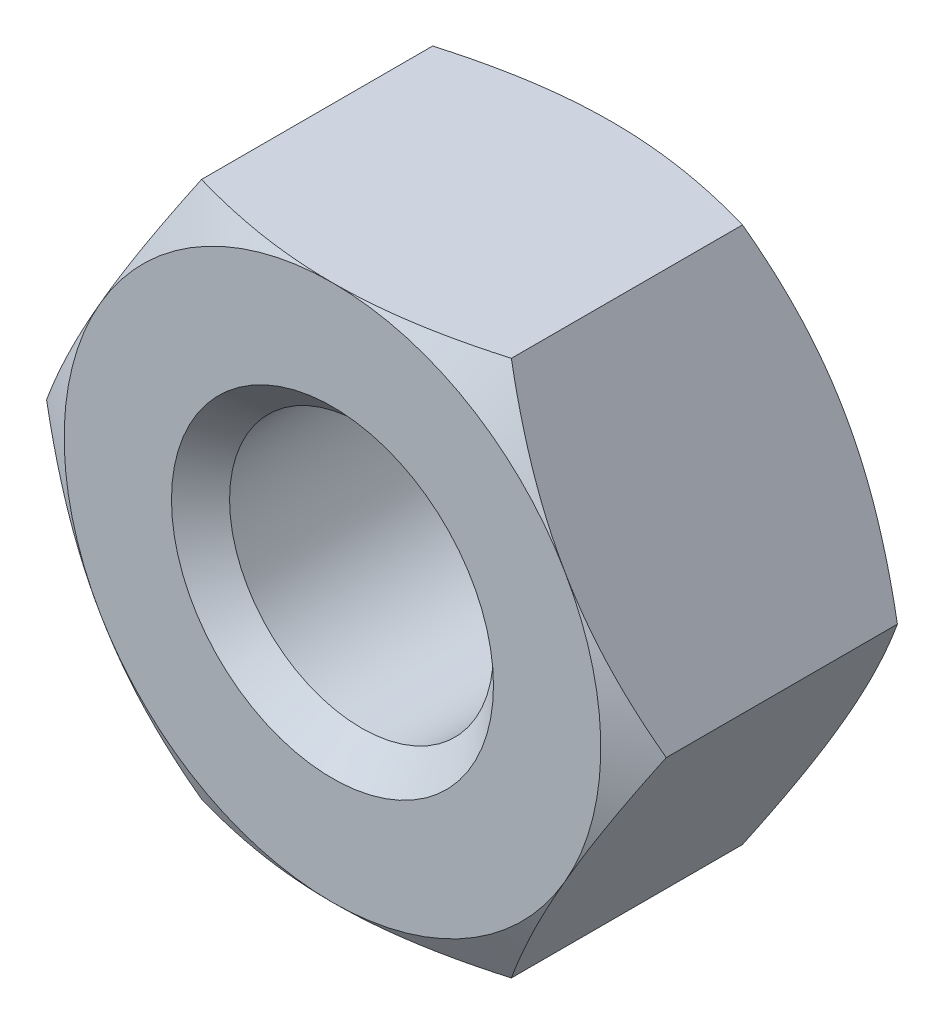
ISO-10303-21;
HEADER;
FILE_DESCRIPTION(('STEP AP214'),'2;1');
FILE_NAME('part.step','',(''),(''),'','','');
FILE_SCHEMA(('AUTOMOTIVE_DESIGN { 1 0 10303 214 1 1 1 1 }'));
ENDSEC;
DATA;
#1=APPLICATION_CONTEXT('core data for automotive mechanical design processes');
#2=APPLICATION_PROTOCOL_DEFINITION('international standard','automotive_design',2000,#1);
#3=PRODUCT_CONTEXT('',#1,'mechanical');
#4=PRODUCT('Part','Part','',(#3));
#5=PRODUCT_RELATED_PRODUCT_CATEGORY('part','',(#4));
#6=PRODUCT_DEFINITION_FORMATION('','',#4);
#7=PRODUCT_DEFINITION_CONTEXT('part definition',#1,'design');
#8=PRODUCT_DEFINITION('design','',#6,#7);
#9=PRODUCT_DEFINITION_SHAPE('','',#8);
#10=(LENGTH_UNIT() NAMED_UNIT(*) SI_UNIT(.MILLI.,.METRE.));
#11=(NAMED_UNIT(*) PLANE_ANGLE_UNIT() SI_UNIT($,.RADIAN.));
#12=(NAMED_UNIT(*) SI_UNIT($,.STERADIAN.) SOLID_ANGLE_UNIT());
#13=UNCERTAINTY_MEASURE_WITH_UNIT(LENGTH_MEASURE(1.E-05),#10,'distance_accuracy_value','');
#14=(GEOMETRIC_REPRESENTATION_CONTEXT(3) GLOBAL_UNCERTAINTY_ASSIGNED_CONTEXT((#13)) GLOBAL_UNIT_ASSIGNED_CONTEXT((#10,
#11,#12)) REPRESENTATION_CONTEXT('',''));
#15=CARTESIAN_POINT('',(0.,0.,0.));
#16=DIRECTION('',(0.,0.,1.));
#17=DIRECTION('',(1.,0.,0.));
#18=AXIS2_PLACEMENT_3D('',#15,#16,#17);
#19=CARTESIAN_POINT('',(4.3301270189222,2.5,-1.));
#20=DIRECTION('',(0.866025403784439,0.5,0.));
#21=DIRECTION('',(-0.5,0.866025403784439,0.));
#22=AXIS2_PLACEMENT_3D('',#19,#20,#21);
#23=PLANE('',#22);
#24=CARTESIAN_POINT('',(2.8852546197118,5.00259240588635,0.44744645862196));
#25=CARTESIAN_POINT('',(3.65965258773407,3.66129577999366,0.));
#26=CARTESIAN_POINT('',(4.3301270189222,2.5,0.));
#27=CARTESIAN_POINT('',(5.0006014501103,1.33870422000634,0.));
#28=CARTESIAN_POINT('',(5.77499941813259,-0.00259240588634623,0.447446458621961));
#29=(BOUNDED_CURVE() B_SPLINE_CURVE(2,(#24,#25,#26,#27,#28),.UNSPECIFIED.,.F.,
.F.) B_SPLINE_CURVE_WITH_KNOTS((3,2,3),(0.,2.9316581987571,5.8633163975142),
.UNSPECIFIED.) CURVE() GEOMETRIC_REPRESENTATION_ITEM() RATIONAL_B_SPLINE_CURVE((1.,
1.03802697460134,1.,1.03802697460135,1.)) REPRESENTATION_ITEM(''));
#30=CARTESIAN_POINT('',(2.88675134594813,5.,0.446581987385203));
#31=VERTEX_POINT('',#30);
#32=CARTESIAN_POINT('',(4.3301270189222,2.5,0.));
#33=VERTEX_POINT('',#32);
#34=EDGE_CURVE('E154',#31,#33,#29,.T.);
#35=ORIENTED_EDGE('',*,*,#34,.F.);
#36=DIRECTION('',(0.,0.,1.));
#37=VECTOR('',#36,1.);
#38=CARTESIAN_POINT('',(2.88675134594813,5.,-1.));
#39=LINE('',#38,#37);
#40=CARTESIAN_POINT('',(2.88675134594813,5.,4.7534180126148));
#41=VERTEX_POINT('',#40);
#42=EDGE_CURVE('E11',#31,#41,#39,.T.);
#43=ORIENTED_EDGE('',*,*,#42,.T.);
#44=CARTESIAN_POINT('',(5.77499941813259,-0.00259240588634834,4.75255354137804));
#45=CARTESIAN_POINT('',(5.00060145011031,1.33870422000633,5.19999999999999));
#46=CARTESIAN_POINT('',(4.3301270189222,2.5,5.2));
#47=CARTESIAN_POINT('',(3.65965258773408,3.66129577999367,5.2));
#48=CARTESIAN_POINT('',(2.88525461971179,5.00259240588635,4.75255354137804));
#49=(BOUNDED_CURVE() B_SPLINE_CURVE(2,(#44,#45,#46,#47,#48),.UNSPECIFIED.,.F.,
.F.) B_SPLINE_CURVE_WITH_KNOTS((3,2,3),(0.,2.9316581987571,5.86331639751421),
.UNSPECIFIED.) CURVE() GEOMETRIC_REPRESENTATION_ITEM() RATIONAL_B_SPLINE_CURVE((1.,
1.03802697460133,1.,1.03802697460132,1.)) REPRESENTATION_ITEM(''));
#50=CARTESIAN_POINT('',(4.3301270189222,2.5,5.2));
#51=VERTEX_POINT('',#50);
#52=EDGE_CURVE('E20',#51,#41,#49,.T.);
#53=ORIENTED_EDGE('',*,*,#52,.F.);
#54=CARTESIAN_POINT('',(5.77499941813259,-0.00259240588634834,4.75255354137804));
#55=CARTESIAN_POINT('',(5.00060145011031,1.33870422000633,5.19999999999999));
#56=CARTESIAN_POINT('',(4.3301270189222,2.5,5.2));
#57=CARTESIAN_POINT('',(3.65965258773408,3.66129577999367,5.2));
#58=CARTESIAN_POINT('',(2.88525461971179,5.00259240588635,4.75255354137804));
#59=(BOUNDED_CURVE() B_SPLINE_CURVE(2,(#54,#55,#56,#57,#58),.UNSPECIFIED.,.F.,
.F.) B_SPLINE_CURVE_WITH_KNOTS((3,2,3),(0.,2.9316581987571,5.86331639751421),
.UNSPECIFIED.) CURVE() GEOMETRIC_REPRESENTATION_ITEM() RATIONAL_B_SPLINE_CURVE((1.,
1.03802697460133,1.,1.03802697460132,1.)) REPRESENTATION_ITEM(''));
#60=CARTESIAN_POINT('',(5.77350269189626,0.,4.7534180126148));
#61=VERTEX_POINT('',#60);
#62=EDGE_CURVE('E195',#61,#51,#59,.T.);
#63=ORIENTED_EDGE('',*,*,#62,.F.);
#64=DIRECTION('',(0.,0.,1.));
#65=VECTOR('',#64,1.);
#66=CARTESIAN_POINT('',(5.77350269189626,0.,-1.));
#67=LINE('',#66,#65);
#68=CARTESIAN_POINT('',(5.77350269189626,0.,0.446581987385204));
#69=VERTEX_POINT('',#68);
#70=EDGE_CURVE('E126',#69,#61,#67,.T.);
#71=ORIENTED_EDGE('',*,*,#70,.F.);
#72=CARTESIAN_POINT('',(2.8852546197118,5.00259240588635,0.44744645862196));
#73=CARTESIAN_POINT('',(3.65965258773407,3.66129577999366,0.));
#74=CARTESIAN_POINT('',(4.3301270189222,2.5,0.));
#75=CARTESIAN_POINT('',(5.0006014501103,1.33870422000634,0.));
#76=CARTESIAN_POINT('',(5.77499941813259,-0.00259240588634623,0.447446458621961));
#77=(BOUNDED_CURVE() B_SPLINE_CURVE(2,(#72,#73,#74,#75,#76),.UNSPECIFIED.,.F.,
.F.) B_SPLINE_CURVE_WITH_KNOTS((3,2,3),(0.,2.9316581987571,5.8633163975142),
.UNSPECIFIED.) CURVE() GEOMETRIC_REPRESENTATION_ITEM() RATIONAL_B_SPLINE_CURVE((1.,
1.03802697460134,1.,1.03802697460135,1.)) REPRESENTATION_ITEM(''));
#78=EDGE_CURVE('E182',#33,#69,#77,.T.);
#79=ORIENTED_EDGE('',*,*,#78,.F.);
#80=EDGE_LOOP('',(#35,#43,#53,#63,#71,#79));
#81=FACE_BOUND('',#80,.T.);
#82=ADVANCED_FACE('F16',(#81),#23,.T.);
#83=CARTESIAN_POINT('',(0.,5.,-1.));
#84=DIRECTION('',(0.,1.,0.));
#85=DIRECTION('',(-1.,0.,0.));
#86=AXIS2_PLACEMENT_3D('',#83,#84,#85);
#87=PLANE('',#86);
#88=CARTESIAN_POINT('',(-2.88974479842079,5.,0.44744645862196));
#89=CARTESIAN_POINT('',(-1.34094886237623,5.,0.));
#90=CARTESIAN_POINT('',(0.,5.,0.));
#91=CARTESIAN_POINT('',(1.34094886237623,5.,0.));
#92=CARTESIAN_POINT('',(2.88974479842079,5.,0.44744645862196));
#93=(BOUNDED_CURVE() B_SPLINE_CURVE(2,(#88,#89,#90,#91,#92),.UNSPECIFIED.,.F.,
.F.) B_SPLINE_CURVE_WITH_KNOTS((3,2,3),(0.,2.9316581987571,5.8633163975142),
.UNSPECIFIED.) CURVE() GEOMETRIC_REPRESENTATION_ITEM() RATIONAL_B_SPLINE_CURVE((1.,
1.03802697460134,1.,1.03802697460134,1.)) REPRESENTATION_ITEM(''));
#94=CARTESIAN_POINT('',(-2.88675134594813,5.,0.446581987385203));
#95=VERTEX_POINT('',#94);
#96=CARTESIAN_POINT('',(0.,5.,0.));
#97=VERTEX_POINT('',#96);
#98=EDGE_CURVE('E130',#95,#97,#93,.T.);
#99=ORIENTED_EDGE('',*,*,#98,.F.);
#100=DIRECTION('',(0.,0.,1.));
#101=VECTOR('',#100,1.);
#102=CARTESIAN_POINT('',(-2.88675134594812,5.,-1.));
#103=LINE('',#102,#101);
#104=CARTESIAN_POINT('',(-2.88675134594813,5.,4.7534180126148));
#105=VERTEX_POINT('',#104);
#106=EDGE_CURVE('E29',#95,#105,#103,.T.);
#107=ORIENTED_EDGE('',*,*,#106,.T.);
#108=CARTESIAN_POINT('',(2.88974479842079,5.,4.75255354137804));
#109=CARTESIAN_POINT('',(1.34094886237624,5.,5.2));
#110=CARTESIAN_POINT('',(0.,5.,5.2));
#111=CARTESIAN_POINT('',(-1.34094886237624,5.,5.2));
#112=CARTESIAN_POINT('',(-2.88974479842079,5.,4.75255354137804));
#113=(BOUNDED_CURVE() B_SPLINE_CURVE(2,(#108,#109,#110,#111,#112),.UNSPECIFIED.,.F.,
.F.) B_SPLINE_CURVE_WITH_KNOTS((3,2,3),(0.,2.9316581987571,5.8633163975142),
.UNSPECIFIED.) CURVE() GEOMETRIC_REPRESENTATION_ITEM() RATIONAL_B_SPLINE_CURVE((1.,
1.03802697460134,1.,1.03802697460134,1.)) REPRESENTATION_ITEM(''));
#114=CARTESIAN_POINT('',(0.,5.,5.2));
#115=VERTEX_POINT('',#114);
#116=EDGE_CURVE('E291',#115,#105,#113,.T.);
#117=ORIENTED_EDGE('',*,*,#116,.F.);
#118=CARTESIAN_POINT('',(2.88974479842079,5.,4.75255354137804));
#119=CARTESIAN_POINT('',(1.34094886237624,5.,5.2));
#120=CARTESIAN_POINT('',(0.,5.,5.2));
#121=CARTESIAN_POINT('',(-1.34094886237624,5.,5.2));
#122=CARTESIAN_POINT('',(-2.88974479842079,5.,4.75255354137804));
#123=(BOUNDED_CURVE() B_SPLINE_CURVE(2,(#118,#119,#120,#121,#122),.UNSPECIFIED.,.F.,
.F.) B_SPLINE_CURVE_WITH_KNOTS((3,2,3),(0.,2.9316581987571,5.8633163975142),
.UNSPECIFIED.) CURVE() GEOMETRIC_REPRESENTATION_ITEM() RATIONAL_B_SPLINE_CURVE((1.,
1.03802697460134,1.,1.03802697460134,1.)) REPRESENTATION_ITEM(''));
#124=EDGE_CURVE('E298',#41,#115,#123,.T.);
#125=ORIENTED_EDGE('',*,*,#124,.F.);
#126=ORIENTED_EDGE('',*,*,#42,.F.);
#127=CARTESIAN_POINT('',(-2.88974479842079,5.,0.44744645862196));
#128=CARTESIAN_POINT('',(-1.34094886237623,5.,0.));
#129=CARTESIAN_POINT('',(0.,5.,0.));
#130=CARTESIAN_POINT('',(1.34094886237623,5.,0.));
#131=CARTESIAN_POINT('',(2.88974479842079,5.,0.44744645862196));
#132=(BOUNDED_CURVE() B_SPLINE_CURVE(2,(#127,#128,#129,#130,#131),.UNSPECIFIED.,.F.,
.F.) B_SPLINE_CURVE_WITH_KNOTS((3,2,3),(0.,2.9316581987571,5.8633163975142),
.UNSPECIFIED.) CURVE() GEOMETRIC_REPRESENTATION_ITEM() RATIONAL_B_SPLINE_CURVE((1.,
1.03802697460134,1.,1.03802697460134,1.)) REPRESENTATION_ITEM(''));
#133=EDGE_CURVE('E133',#97,#31,#132,.T.);
#134=ORIENTED_EDGE('',*,*,#133,.F.);
#135=EDGE_LOOP('',(#99,#107,#117,#125,#126,#134));
#136=FACE_BOUND('',#135,.T.);
#137=ADVANCED_FACE('F131',(#136),#87,.T.);
#138=CARTESIAN_POINT('',(-4.3301270189222,2.5,-1.));
#139=DIRECTION('',(-0.866025403784439,0.5,0.));
#140=DIRECTION('',(-0.5,-0.866025403784439,0.));
#141=AXIS2_PLACEMENT_3D('',#138,#139,#140);
#142=PLANE('',#141);
#143=CARTESIAN_POINT('',(-5.77499941813259,-0.00259240588634575,0.44744645862196));
#144=CARTESIAN_POINT('',(-5.00060145011031,1.33870422000633,0.));
#145=CARTESIAN_POINT('',(-4.33012701892219,2.5,0.));
#146=CARTESIAN_POINT('',(-3.65965258773407,3.66129577999367,0.));
#147=CARTESIAN_POINT('',(-2.88525461971179,5.00259240588635,0.44744645862196));
#148=(BOUNDED_CURVE() B_SPLINE_CURVE(2,(#143,#144,#145,#146,#147),.UNSPECIFIED.,.F.,
.F.) B_SPLINE_CURVE_WITH_KNOTS((3,2,3),(0.,2.9316581987571,5.86331639751421),
.UNSPECIFIED.) CURVE() GEOMETRIC_REPRESENTATION_ITEM() RATIONAL_B_SPLINE_CURVE((1.,
1.03802697460135,1.,1.03802697460134,1.)) REPRESENTATION_ITEM(''));
#149=CARTESIAN_POINT('',(-5.77350269189626,0.,0.446581987385204));
#150=VERTEX_POINT('',#149);
#151=CARTESIAN_POINT('',(-4.3301270189222,2.5,0.));
#152=VERTEX_POINT('',#151);
#153=EDGE_CURVE('E279',#150,#152,#148,.T.);
#154=ORIENTED_EDGE('',*,*,#153,.F.);
#155=DIRECTION('',(0.,0.,1.));
#156=VECTOR('',#155,1.);
#157=CARTESIAN_POINT('',(-5.77350269189626,0.,-1.));
#158=LINE('',#157,#156);
#159=CARTESIAN_POINT('',(-5.77350269189626,0.,4.7534180126148));
#160=VERTEX_POINT('',#159);
#161=EDGE_CURVE('E170',#150,#160,#158,.T.);
#162=ORIENTED_EDGE('',*,*,#161,.T.);
#163=CARTESIAN_POINT('',(-2.88525461971179,5.00259240588635,4.75255354137804));
#164=CARTESIAN_POINT('',(-3.65965258773406,3.66129577999367,5.19999999999999));
#165=CARTESIAN_POINT('',(-4.33012701892219,2.5,5.2));
#166=CARTESIAN_POINT('',(-5.00060145011031,1.33870422000633,5.2));
#167=CARTESIAN_POINT('',(-5.77499941813259,-0.00259240588634739,4.75255354137804));
#168=(BOUNDED_CURVE() B_SPLINE_CURVE(2,(#163,#164,#165,#166,#167),.UNSPECIFIED.,.F.,
.F.) B_SPLINE_CURVE_WITH_KNOTS((3,2,3),(0.,2.9316581987571,5.86331639751421),
.UNSPECIFIED.) CURVE() GEOMETRIC_REPRESENTATION_ITEM() RATIONAL_B_SPLINE_CURVE((1.,
1.03802697460133,1.,1.03802697460135,1.)) REPRESENTATION_ITEM(''));
#169=CARTESIAN_POINT('',(-4.3301270189222,2.5,5.2));
#170=VERTEX_POINT('',#169);
#171=EDGE_CURVE('E249',#170,#160,#168,.T.);
#172=ORIENTED_EDGE('',*,*,#171,.F.);
#173=CARTESIAN_POINT('',(-2.88525461971179,5.00259240588635,4.75255354137804));
#174=CARTESIAN_POINT('',(-3.65965258773406,3.66129577999367,5.19999999999999));
#175=CARTESIAN_POINT('',(-4.33012701892219,2.5,5.2));
#176=CARTESIAN_POINT('',(-5.00060145011031,1.33870422000633,5.2));
#177=CARTESIAN_POINT('',(-5.77499941813259,-0.00259240588634739,4.75255354137804));
#178=(BOUNDED_CURVE() B_SPLINE_CURVE(2,(#173,#174,#175,#176,#177),.UNSPECIFIED.,.F.,
.F.) B_SPLINE_CURVE_WITH_KNOTS((3,2,3),(0.,2.9316581987571,5.86331639751421),
.UNSPECIFIED.) CURVE() GEOMETRIC_REPRESENTATION_ITEM() RATIONAL_B_SPLINE_CURVE((1.,
1.03802697460133,1.,1.03802697460135,1.)) REPRESENTATION_ITEM(''));
#179=EDGE_CURVE('E121',#105,#170,#178,.T.);
#180=ORIENTED_EDGE('',*,*,#179,.F.);
#181=ORIENTED_EDGE('',*,*,#106,.F.);
#182=CARTESIAN_POINT('',(-5.77499941813259,-0.00259240588634575,0.44744645862196));
#183=CARTESIAN_POINT('',(-5.00060145011031,1.33870422000633,0.));
#184=CARTESIAN_POINT('',(-4.33012701892219,2.5,0.));
#185=CARTESIAN_POINT('',(-3.65965258773407,3.66129577999367,0.));
#186=CARTESIAN_POINT('',(-2.88525461971179,5.00259240588635,0.44744645862196));
#187=(BOUNDED_CURVE() B_SPLINE_CURVE(2,(#182,#183,#184,#185,#186),.UNSPECIFIED.,.F.,
.F.) B_SPLINE_CURVE_WITH_KNOTS((3,2,3),(0.,2.9316581987571,5.86331639751421),
.UNSPECIFIED.) CURVE() GEOMETRIC_REPRESENTATION_ITEM() RATIONAL_B_SPLINE_CURVE((1.,
1.03802697460135,1.,1.03802697460134,1.)) REPRESENTATION_ITEM(''));
#188=EDGE_CURVE('E118',#152,#95,#187,.T.);
#189=ORIENTED_EDGE('',*,*,#188,.F.);
#190=EDGE_LOOP('',(#154,#162,#172,#180,#181,#189));
#191=FACE_BOUND('',#190,.T.);
#192=ADVANCED_FACE('F116',(#191),#142,.T.);
#193=CARTESIAN_POINT('',(4.3301270189222,-2.5,-1.));
#194=DIRECTION('',(0.866025403784439,-0.5,0.));
#195=DIRECTION('',(0.5,0.866025403784439,0.));
#196=AXIS2_PLACEMENT_3D('',#193,#194,#195);
#197=PLANE('',#196);
#198=CARTESIAN_POINT('',(5.77499941813259,0.00259240588634437,0.447446458621961));
#199=CARTESIAN_POINT('',(5.00060145011031,-1.33870422000634,0.));
#200=CARTESIAN_POINT('',(4.3301270189222,-2.5,0.));
#201=CARTESIAN_POINT('',(3.65965258773407,-3.66129577999366,0.));
#202=CARTESIAN_POINT('',(2.8852546197118,-5.00259240588635,0.447446458621961));
#203=(BOUNDED_CURVE() B_SPLINE_CURVE(2,(#198,#199,#200,#201,#202),.UNSPECIFIED.,.F.,
.F.) B_SPLINE_CURVE_WITH_KNOTS((3,2,3),(0.,2.9316581987571,5.8633163975142),
.UNSPECIFIED.) CURVE() GEOMETRIC_REPRESENTATION_ITEM() RATIONAL_B_SPLINE_CURVE((1.,
1.03802697460134,1.,1.03802697460133,1.)) REPRESENTATION_ITEM(''));
#204=CARTESIAN_POINT('',(4.3301270189222,-2.5,0.));
#205=VERTEX_POINT('',#204);
#206=CARTESIAN_POINT('',(2.88675134594813,-5.,0.446581987385204));
#207=VERTEX_POINT('',#206);
#208=EDGE_CURVE('E190',#205,#207,#203,.T.);
#209=ORIENTED_EDGE('',*,*,#208,.F.);
#210=CARTESIAN_POINT('',(5.77499941813259,0.00259240588634437,0.447446458621961));
#211=CARTESIAN_POINT('',(5.00060145011031,-1.33870422000634,0.));
#212=CARTESIAN_POINT('',(4.3301270189222,-2.5,0.));
#213=CARTESIAN_POINT('',(3.65965258773407,-3.66129577999366,0.));
#214=CARTESIAN_POINT('',(2.8852546197118,-5.00259240588635,0.447446458621961));
#215=(BOUNDED_CURVE() B_SPLINE_CURVE(2,(#210,#211,#212,#213,#214),.UNSPECIFIED.,.F.,
.F.) B_SPLINE_CURVE_WITH_KNOTS((3,2,3),(0.,2.9316581987571,5.8633163975142),
.UNSPECIFIED.) CURVE() GEOMETRIC_REPRESENTATION_ITEM() RATIONAL_B_SPLINE_CURVE((1.,
1.03802697460134,1.,1.03802697460133,1.)) REPRESENTATION_ITEM(''));
#216=EDGE_CURVE('E175',#69,#205,#215,.T.);
#217=ORIENTED_EDGE('',*,*,#216,.F.);
#218=ORIENTED_EDGE('',*,*,#70,.T.);
#219=CARTESIAN_POINT('',(2.88525461971179,-5.00259240588635,4.75255354137804));
#220=CARTESIAN_POINT('',(3.65965258773408,-3.66129577999367,5.2));
#221=CARTESIAN_POINT('',(4.3301270189222,-2.5,5.2));
#222=CARTESIAN_POINT('',(5.00060145011032,-1.33870422000633,5.2));
#223=CARTESIAN_POINT('',(5.77499941813259,0.00259240588634845,4.75255354137804));
#224=(BOUNDED_CURVE() B_SPLINE_CURVE(2,(#219,#220,#221,#222,#223),.UNSPECIFIED.,.F.,
.F.) B_SPLINE_CURVE_WITH_KNOTS((3,2,3),(0.,2.9316581987571,5.86331639751421),
.UNSPECIFIED.) CURVE() GEOMETRIC_REPRESENTATION_ITEM() RATIONAL_B_SPLINE_CURVE((1.,
1.03802697460132,1.,1.03802697460131,1.)) REPRESENTATION_ITEM(''));
#225=CARTESIAN_POINT('',(4.3301270189222,-2.5,5.2));
#226=VERTEX_POINT('',#225);
#227=EDGE_CURVE('E336',#226,#61,#224,.T.);
#228=ORIENTED_EDGE('',*,*,#227,.F.);
#229=CARTESIAN_POINT('',(2.88525461971179,-5.00259240588635,4.75255354137804));
#230=CARTESIAN_POINT('',(3.65965258773408,-3.66129577999367,5.2));
#231=CARTESIAN_POINT('',(4.3301270189222,-2.5,5.2));
#232=CARTESIAN_POINT('',(5.00060145011032,-1.33870422000633,5.2));
#233=CARTESIAN_POINT('',(5.77499941813259,0.00259240588634845,4.75255354137804));
#234=(BOUNDED_CURVE() B_SPLINE_CURVE(2,(#229,#230,#231,#232,#233),.UNSPECIFIED.,.F.,
.F.) B_SPLINE_CURVE_WITH_KNOTS((3,2,3),(0.,2.9316581987571,5.86331639751421),
.UNSPECIFIED.) CURVE() GEOMETRIC_REPRESENTATION_ITEM() RATIONAL_B_SPLINE_CURVE((1.,
1.03802697460132,1.,1.03802697460131,1.)) REPRESENTATION_ITEM(''));
#235=CARTESIAN_POINT('',(2.88675134594813,-5.,4.7534180126148));
#236=VERTEX_POINT('',#235);
#237=EDGE_CURVE('E209',#236,#226,#234,.T.);
#238=ORIENTED_EDGE('',*,*,#237,.F.);
#239=DIRECTION('',(0.,0.,1.));
#240=VECTOR('',#239,1.);
#241=CARTESIAN_POINT('',(2.88675134594813,-5.,-1.));
#242=LINE('',#241,#240);
#243=EDGE_CURVE('E167',#207,#236,#242,.T.);
#244=ORIENTED_EDGE('',*,*,#243,.F.);
#245=EDGE_LOOP('',(#209,#217,#218,#228,#238,#244));
#246=FACE_BOUND('',#245,.T.);
#247=ADVANCED_FACE('F644',(#246),#197,.T.);
#248=CARTESIAN_POINT('',(0.,-5.,-1.));
#249=DIRECTION('',(0.,-1.,0.));
#250=DIRECTION('',(1.,0.,0.));
#251=AXIS2_PLACEMENT_3D('',#248,#249,#250);
#252=PLANE('',#251);
#253=CARTESIAN_POINT('',(2.88974479842079,-5.,0.44744645862196));
#254=CARTESIAN_POINT('',(1.34094886237624,-5.,0.));
#255=CARTESIAN_POINT('',(0.,-5.,0.));
#256=CARTESIAN_POINT('',(-1.34094886237624,-5.,0.));
#257=CARTESIAN_POINT('',(-2.88974479842079,-5.,0.44744645862196));
#258=(BOUNDED_CURVE() B_SPLINE_CURVE(2,(#253,#254,#255,#256,#257),.UNSPECIFIED.,.F.,
.F.) B_SPLINE_CURVE_WITH_KNOTS((3,2,3),(0.,2.9316581987571,5.8633163975142),
.UNSPECIFIED.) CURVE() GEOMETRIC_REPRESENTATION_ITEM() RATIONAL_B_SPLINE_CURVE((1.,
1.03802697460135,1.,1.03802697460135,1.)) REPRESENTATION_ITEM(''));
#259=CARTESIAN_POINT('',(0.,-5.,0.));
#260=VERTEX_POINT('',#259);
#261=CARTESIAN_POINT('',(-2.88675134594813,-5.,0.446581987385205));
#262=VERTEX_POINT('',#261);
#263=EDGE_CURVE('E372',#260,#262,#258,.T.);
#264=ORIENTED_EDGE('',*,*,#263,.F.);
#265=CARTESIAN_POINT('',(2.88974479842079,-5.,0.44744645862196));
#266=CARTESIAN_POINT('',(1.34094886237624,-5.,0.));
#267=CARTESIAN_POINT('',(0.,-5.,0.));
#268=CARTESIAN_POINT('',(-1.34094886237624,-5.,0.));
#269=CARTESIAN_POINT('',(-2.88974479842079,-5.,0.44744645862196));
#270=(BOUNDED_CURVE() B_SPLINE_CURVE(2,(#265,#266,#267,#268,#269),.UNSPECIFIED.,.F.,
.F.) B_SPLINE_CURVE_WITH_KNOTS((3,2,3),(0.,2.9316581987571,5.8633163975142),
.UNSPECIFIED.) CURVE() GEOMETRIC_REPRESENTATION_ITEM() RATIONAL_B_SPLINE_CURVE((1.,
1.03802697460135,1.,1.03802697460135,1.)) REPRESENTATION_ITEM(''));
#271=EDGE_CURVE('E191',#207,#260,#270,.T.);
#272=ORIENTED_EDGE('',*,*,#271,.F.);
#273=ORIENTED_EDGE('',*,*,#243,.T.);
#274=CARTESIAN_POINT('',(-2.88974479842079,-5.,4.75255354137804));
#275=CARTESIAN_POINT('',(-1.34094886237624,-5.,5.2));
#276=CARTESIAN_POINT('',(0.,-5.,5.2));
#277=CARTESIAN_POINT('',(1.34094886237624,-5.,5.2));
#278=CARTESIAN_POINT('',(2.88974479842079,-5.,4.75255354137804));
#279=(BOUNDED_CURVE() B_SPLINE_CURVE(2,(#274,#275,#276,#277,#278),.UNSPECIFIED.,.F.,
.F.) B_SPLINE_CURVE_WITH_KNOTS((3,2,3),(0.,2.9316581987571,5.86331639751421),
.UNSPECIFIED.) CURVE() GEOMETRIC_REPRESENTATION_ITEM() RATIONAL_B_SPLINE_CURVE((1.,
1.03802697460133,1.,1.03802697460134,1.)) REPRESENTATION_ITEM(''));
#280=CARTESIAN_POINT('',(0.,-5.,5.2));
#281=VERTEX_POINT('',#280);
#282=EDGE_CURVE('E201',#281,#236,#279,.T.);
#283=ORIENTED_EDGE('',*,*,#282,.F.);
#284=CARTESIAN_POINT('',(-2.88974479842079,-5.,4.75255354137804));
#285=CARTESIAN_POINT('',(-1.34094886237624,-5.,5.2));
#286=CARTESIAN_POINT('',(0.,-5.,5.2));
#287=CARTESIAN_POINT('',(1.34094886237624,-5.,5.2));
#288=CARTESIAN_POINT('',(2.88974479842079,-5.,4.75255354137804));
#289=(BOUNDED_CURVE() B_SPLINE_CURVE(2,(#284,#285,#286,#287,#288),.UNSPECIFIED.,.F.,
.F.) B_SPLINE_CURVE_WITH_KNOTS((3,2,3),(0.,2.9316581987571,5.86331639751421),
.UNSPECIFIED.) CURVE() GEOMETRIC_REPRESENTATION_ITEM() RATIONAL_B_SPLINE_CURVE((1.,
1.03802697460133,1.,1.03802697460134,1.)) REPRESENTATION_ITEM(''));
#290=CARTESIAN_POINT('',(-2.88675134594813,-5.,4.7534180126148));
#291=VERTEX_POINT('',#290);
#292=EDGE_CURVE('E166',#291,#281,#289,.T.);
#293=ORIENTED_EDGE('',*,*,#292,.F.);
#294=DIRECTION('',(0.,0.,1.));
#295=VECTOR('',#294,1.);
#296=CARTESIAN_POINT('',(-2.88675134594813,-5.,-1.));
#297=LINE('',#296,#295);
#298=EDGE_CURVE('E173',#262,#291,#297,.T.);
#299=ORIENTED_EDGE('',*,*,#298,.F.);
#300=EDGE_LOOP('',(#264,#272,#273,#283,#293,#299));
#301=FACE_BOUND('',#300,.T.);
#302=ADVANCED_FACE('F635',(#301),#252,.T.);
#303=CARTESIAN_POINT('',(-4.3301270189222,-2.5,-1.));
#304=DIRECTION('',(-0.866025403784439,-0.5,0.));
#305=DIRECTION('',(0.5,-0.866025403784439,0.));
#306=AXIS2_PLACEMENT_3D('',#303,#304,#305);
#307=PLANE('',#306);
#308=CARTESIAN_POINT('',(-2.8852546197118,-5.00259240588634,0.447446458621961));
#309=CARTESIAN_POINT('',(-3.65965258773408,-3.66129577999366,0.));
#310=CARTESIAN_POINT('',(-4.3301270189222,-2.5,0.));
#311=CARTESIAN_POINT('',(-5.00060145011031,-1.33870422000634,0.));
#312=CARTESIAN_POINT('',(-5.77499941813259,0.00259240588634723,0.44744645862196));
#313=(BOUNDED_CURVE() B_SPLINE_CURVE(2,(#308,#309,#310,#311,#312),.UNSPECIFIED.,.F.,
.F.) B_SPLINE_CURVE_WITH_KNOTS((3,2,3),(0.,2.9316581987571,5.8633163975142),
.UNSPECIFIED.) CURVE() GEOMETRIC_REPRESENTATION_ITEM() RATIONAL_B_SPLINE_CURVE((1.,
1.03802697460133,1.,1.03802697460133,1.)) REPRESENTATION_ITEM(''));
#314=CARTESIAN_POINT('',(-4.3301270189222,-2.5,0.));
#315=VERTEX_POINT('',#314);
#316=EDGE_CURVE('E141',#315,#150,#313,.T.);
#317=ORIENTED_EDGE('',*,*,#316,.F.);
#318=CARTESIAN_POINT('',(-2.8852546197118,-5.00259240588634,0.447446458621961));
#319=CARTESIAN_POINT('',(-3.65965258773408,-3.66129577999366,0.));
#320=CARTESIAN_POINT('',(-4.3301270189222,-2.5,0.));
#321=CARTESIAN_POINT('',(-5.00060145011031,-1.33870422000634,0.));
#322=CARTESIAN_POINT('',(-5.77499941813259,0.00259240588634723,0.44744645862196));
#323=(BOUNDED_CURVE() B_SPLINE_CURVE(2,(#318,#319,#320,#321,#322),.UNSPECIFIED.,.F.,
.F.) B_SPLINE_CURVE_WITH_KNOTS((3,2,3),(0.,2.9316581987571,5.8633163975142),
.UNSPECIFIED.) CURVE() GEOMETRIC_REPRESENTATION_ITEM() RATIONAL_B_SPLINE_CURVE((1.,
1.03802697460133,1.,1.03802697460133,1.)) REPRESENTATION_ITEM(''));
#324=EDGE_CURVE('E259',#262,#315,#323,.T.);
#325=ORIENTED_EDGE('',*,*,#324,.F.);
#326=ORIENTED_EDGE('',*,*,#298,.T.);
#327=CARTESIAN_POINT('',(-5.77499941813259,0.00259240588634893,4.75255354137804));
#328=CARTESIAN_POINT('',(-5.00060145011031,-1.33870422000633,5.2));
#329=CARTESIAN_POINT('',(-4.3301270189222,-2.5,5.2));
#330=CARTESIAN_POINT('',(-3.65965258773408,-3.66129577999367,5.2));
#331=CARTESIAN_POINT('',(-2.8852546197118,-5.00259240588635,4.75255354137804));
#332=(BOUNDED_CURVE() B_SPLINE_CURVE(2,(#327,#328,#329,#330,#331),.UNSPECIFIED.,.F.,
.F.) B_SPLINE_CURVE_WITH_KNOTS((3,2,3),(0.,2.9316581987571,5.8633163975142),
.UNSPECIFIED.) CURVE() GEOMETRIC_REPRESENTATION_ITEM() RATIONAL_B_SPLINE_CURVE((1.,
1.03802697460134,1.,1.03802697460133,1.)) REPRESENTATION_ITEM(''));
#333=CARTESIAN_POINT('',(-4.3301270189222,-2.5,5.2));
#334=VERTEX_POINT('',#333);
#335=EDGE_CURVE('E165',#334,#291,#332,.T.);
#336=ORIENTED_EDGE('',*,*,#335,.F.);
#337=CARTESIAN_POINT('',(-5.77499941813259,0.00259240588634893,4.75255354137804));
#338=CARTESIAN_POINT('',(-5.00060145011031,-1.33870422000633,5.2));
#339=CARTESIAN_POINT('',(-4.3301270189222,-2.5,5.2));
#340=CARTESIAN_POINT('',(-3.65965258773408,-3.66129577999367,5.2));
#341=CARTESIAN_POINT('',(-2.8852546197118,-5.00259240588635,4.75255354137804));
#342=(BOUNDED_CURVE() B_SPLINE_CURVE(2,(#337,#338,#339,#340,#341),.UNSPECIFIED.,.F.,
.F.) B_SPLINE_CURVE_WITH_KNOTS((3,2,3),(0.,2.9316581987571,5.8633163975142),
.UNSPECIFIED.) CURVE() GEOMETRIC_REPRESENTATION_ITEM() RATIONAL_B_SPLINE_CURVE((1.,
1.03802697460134,1.,1.03802697460133,1.)) REPRESENTATION_ITEM(''));
#343=EDGE_CURVE('E296',#160,#334,#342,.T.);
#344=ORIENTED_EDGE('',*,*,#343,.F.);
#345=ORIENTED_EDGE('',*,*,#161,.F.);
#346=EDGE_LOOP('',(#317,#325,#326,#336,#344,#345));
#347=FACE_BOUND('',#346,.T.);
#348=ADVANCED_FACE('F416',(#347),#307,.T.);
#349=CARTESIAN_POINT('',(4.,0.,0.));
#350=DIRECTION('',(0.,0.,-1.));
#351=DIRECTION('',(-1.,0.,0.));
#352=AXIS2_PLACEMENT_3D('',#349,#350,#351);
#353=PLANE('',#352);
#354=CARTESIAN_POINT('',(0.,0.,0.));
#355=DIRECTION('',(0.,0.,1.));
#356=DIRECTION('',(1.,0.,0.));
#357=AXIS2_PLACEMENT_3D('',#354,#355,#356);
#358=CIRCLE('',#357,3.);
#359=CARTESIAN_POINT('',(3.,0.,0.));
#360=VERTEX_POINT('',#359);
#361=EDGE_CURVE('E36',#360,#360,#358,.T.);
#362=ORIENTED_EDGE('',*,*,#361,.T.);
#363=EDGE_LOOP('',(#362));
#364=FACE_BOUND('',#363,.T.);
#365=CARTESIAN_POINT('',(0.,0.,0.));
#366=DIRECTION('',(0.,0.,1.));
#367=DIRECTION('',(1.,0.,0.));
#368=AXIS2_PLACEMENT_3D('',#365,#366,#367);
#369=CIRCLE('',#368,5.);
#370=EDGE_CURVE('E181',#205,#33,#369,.T.);
#371=ORIENTED_EDGE('',*,*,#370,.F.);
#372=CARTESIAN_POINT('',(0.,0.,0.));
#373=DIRECTION('',(0.,0.,1.));
#374=DIRECTION('',(1.,0.,0.));
#375=AXIS2_PLACEMENT_3D('',#372,#373,#374);
#376=CIRCLE('',#375,5.);
#377=EDGE_CURVE('E183',#260,#205,#376,.T.);
#378=ORIENTED_EDGE('',*,*,#377,.F.);
#379=CARTESIAN_POINT('',(0.,0.,0.));
#380=DIRECTION('',(0.,0.,1.));
#381=DIRECTION('',(1.,0.,0.));
#382=AXIS2_PLACEMENT_3D('',#379,#380,#381);
#383=CIRCLE('',#382,5.);
#384=EDGE_CURVE('E316',#315,#260,#383,.T.);
#385=ORIENTED_EDGE('',*,*,#384,.F.);
#386=CARTESIAN_POINT('',(0.,0.,0.));
#387=DIRECTION('',(0.,0.,1.));
#388=DIRECTION('',(1.,0.,0.));
#389=AXIS2_PLACEMENT_3D('',#386,#387,#388);
#390=CIRCLE('',#389,5.);
#391=EDGE_CURVE('E148',#152,#315,#390,.T.);
#392=ORIENTED_EDGE('',*,*,#391,.F.);
#393=CARTESIAN_POINT('',(0.,0.,0.));
#394=DIRECTION('',(0.,0.,1.));
#395=DIRECTION('',(1.,0.,0.));
#396=AXIS2_PLACEMENT_3D('',#393,#394,#395);
#397=CIRCLE('',#396,5.);
#398=EDGE_CURVE('E137',#97,#152,#397,.T.);
#399=ORIENTED_EDGE('',*,*,#398,.F.);
#400=CARTESIAN_POINT('',(0.,0.,0.));
#401=DIRECTION('',(0.,0.,1.));
#402=DIRECTION('',(1.,0.,0.));
#403=AXIS2_PLACEMENT_3D('',#400,#401,#402);
#404=CIRCLE('',#403,5.);
#405=EDGE_CURVE('E285',#33,#97,#404,.T.);
#406=ORIENTED_EDGE('',*,*,#405,.F.);
#407=EDGE_LOOP('',(#371,#378,#385,#392,#399,#406));
#408=FACE_BOUND('',#407,.T.);
#409=ADVANCED_FACE('F505',(#364,#408),#353,.T.);
#410=CARTESIAN_POINT('',(0.,0.,0.270625));
#411=DIRECTION('',(0.,0.,-1.));
#412=DIRECTION('',(1.,0.,0.));
#413=AXIS2_PLACEMENT_3D('',#410,#411,#412);
#414=CONICAL_SURFACE('',#413,2.729375,0.785398163397448);
#415=CARTESIAN_POINT('',(0.,0.,0.54125));
#416=DIRECTION('',(0.,0.,1.));
#417=DIRECTION('',(1.,0.,0.));
#418=AXIS2_PLACEMENT_3D('',#415,#416,#417);
#419=CIRCLE('',#418,2.45875);
#420=CARTESIAN_POINT('',(2.45875,0.,0.54125));
#421=VERTEX_POINT('',#420);
#422=EDGE_CURVE('E174',#421,#421,#419,.T.);
#423=ORIENTED_EDGE('',*,*,#422,.T.);
#424=EDGE_LOOP('',(#423));
#425=FACE_BOUND('',#424,.T.);
#426=ORIENTED_EDGE('',*,*,#361,.F.);
#427=EDGE_LOOP('',(#426));
#428=FACE_BOUND('',#427,.T.);
#429=ADVANCED_FACE('F538',(#425,#428),#414,.F.);
#430=CARTESIAN_POINT('',(0.,0.,2.6));
#431=DIRECTION('',(0.,0.,-1.));
#432=DIRECTION('',(1.,0.,0.));
#433=AXIS2_PLACEMENT_3D('',#430,#431,#432);
#434=CYLINDRICAL_SURFACE('',#433,2.45875);
#435=CARTESIAN_POINT('',(0.,0.,4.65875));
#436=DIRECTION('',(0.,0.,1.));
#437=DIRECTION('',(1.,0.,0.));
#438=AXIS2_PLACEMENT_3D('',#435,#436,#437);
#439=CIRCLE('',#438,2.45875);
#440=CARTESIAN_POINT('',(2.45875,0.,4.65875));
#441=VERTEX_POINT('',#440);
#442=EDGE_CURVE('E327',#441,#441,#439,.T.);
#443=ORIENTED_EDGE('',*,*,#442,.T.);
#444=EDGE_LOOP('',(#443));
#445=FACE_BOUND('',#444,.T.);
#446=ORIENTED_EDGE('',*,*,#422,.F.);
#447=EDGE_LOOP('',(#446));
#448=FACE_BOUND('',#447,.T.);
#449=ADVANCED_FACE('F531',(#445,#448),#434,.F.);
#450=CARTESIAN_POINT('',(0.,0.,4.929375));
#451=DIRECTION('',(0.,0.,1.));
#452=DIRECTION('',(1.,0.,0.));
#453=AXIS2_PLACEMENT_3D('',#450,#451,#452);
#454=CONICAL_SURFACE('',#453,2.729375,0.785398163397448);
#455=CARTESIAN_POINT('',(0.,0.,5.2));
#456=DIRECTION('',(0.,0.,1.));
#457=DIRECTION('',(1.,0.,0.));
#458=AXIS2_PLACEMENT_3D('',#455,#456,#457);
#459=CIRCLE('',#458,3.);
#460=CARTESIAN_POINT('',(3.,0.,5.2));
#461=VERTEX_POINT('',#460);
#462=EDGE_CURVE('E326',#461,#461,#459,.T.);
#463=ORIENTED_EDGE('',*,*,#462,.T.);
#464=EDGE_LOOP('',(#463));
#465=FACE_BOUND('',#464,.T.);
#466=ORIENTED_EDGE('',*,*,#442,.F.);
#467=EDGE_LOOP('',(#466));
#468=FACE_BOUND('',#467,.T.);
#469=ADVANCED_FACE('F529',(#465,#468),#454,.F.);
#470=CARTESIAN_POINT('',(4.,0.,5.2));
#471=DIRECTION('',(0.,0.,1.));
#472=DIRECTION('',(1.,0.,0.));
#473=AXIS2_PLACEMENT_3D('',#470,#471,#472);
#474=PLANE('',#473);
#475=CARTESIAN_POINT('',(0.,0.,5.2));
#476=DIRECTION('',(0.,0.,1.));
#477=DIRECTION('',(1.,0.,0.));
#478=AXIS2_PLACEMENT_3D('',#475,#476,#477);
#479=CIRCLE('',#478,5.);
#480=EDGE_CURVE('E192',#226,#51,#479,.T.);
#481=ORIENTED_EDGE('',*,*,#480,.T.);
#482=CARTESIAN_POINT('',(0.,0.,5.2));
#483=DIRECTION('',(0.,0.,1.));
#484=DIRECTION('',(1.,0.,0.));
#485=AXIS2_PLACEMENT_3D('',#482,#483,#484);
#486=CIRCLE('',#485,5.);
#487=EDGE_CURVE('E307',#51,#115,#486,.T.);
#488=ORIENTED_EDGE('',*,*,#487,.T.);
#489=CARTESIAN_POINT('',(0.,0.,5.2));
#490=DIRECTION('',(0.,0.,1.));
#491=DIRECTION('',(1.,0.,0.));
#492=AXIS2_PLACEMENT_3D('',#489,#490,#491);
#493=CIRCLE('',#492,5.);
#494=EDGE_CURVE('E297',#115,#170,#493,.T.);
#495=ORIENTED_EDGE('',*,*,#494,.T.);
#496=CARTESIAN_POINT('',(0.,0.,5.2));
#497=DIRECTION('',(0.,0.,1.));
#498=DIRECTION('',(1.,0.,0.));
#499=AXIS2_PLACEMENT_3D('',#496,#497,#498);
#500=CIRCLE('',#499,5.);
#501=EDGE_CURVE('E317',#170,#334,#500,.T.);
#502=ORIENTED_EDGE('',*,*,#501,.T.);
#503=CARTESIAN_POINT('',(0.,0.,5.2));
#504=DIRECTION('',(0.,0.,1.));
#505=DIRECTION('',(1.,0.,0.));
#506=AXIS2_PLACEMENT_3D('',#503,#504,#505);
#507=CIRCLE('',#506,5.);
#508=EDGE_CURVE('E158',#334,#281,#507,.T.);
#509=ORIENTED_EDGE('',*,*,#508,.T.);
#510=CARTESIAN_POINT('',(0.,0.,5.2));
#511=DIRECTION('',(0.,0.,1.));
#512=DIRECTION('',(1.,0.,0.));
#513=AXIS2_PLACEMENT_3D('',#510,#511,#512);
#514=CIRCLE('',#513,5.);
#515=EDGE_CURVE('E221',#281,#226,#514,.T.);
#516=ORIENTED_EDGE('',*,*,#515,.T.);
#517=EDGE_LOOP('',(#481,#488,#495,#502,#509,#516));
#518=FACE_BOUND('',#517,.T.);
#519=ORIENTED_EDGE('',*,*,#462,.F.);
#520=EDGE_LOOP('',(#519));
#521=FACE_BOUND('',#520,.T.);
#522=ADVANCED_FACE('F419',(#518,#521),#474,.T.);
#523=CARTESIAN_POINT('',(0.,0.,4.97627677068902));
#524=DIRECTION('',(0.,0.,-1.));
#525=DIRECTION('',(1.,0.,0.));
#526=AXIS2_PLACEMENT_3D('',#523,#524,#525);
#527=CONICAL_SURFACE('',#526,5.3875,1.0471975511966);
#528=ORIENTED_EDGE('',*,*,#52,.T.);
#529=ORIENTED_EDGE('',*,*,#124,.T.);
#530=ORIENTED_EDGE('',*,*,#487,.F.);
#531=EDGE_LOOP('',(#528,#529,#530));
#532=FACE_BOUND('',#531,.T.);
#533=ADVANCED_FACE('F429',(#532),#527,.T.);
#534=CARTESIAN_POINT('',(0.,0.,4.97627677068902));
#535=DIRECTION('',(0.,0.,-1.));
#536=DIRECTION('',(1.,0.,0.));
#537=AXIS2_PLACEMENT_3D('',#534,#535,#536);
#538=CONICAL_SURFACE('',#537,5.3875,1.0471975511966);
#539=ORIENTED_EDGE('',*,*,#227,.T.);
#540=ORIENTED_EDGE('',*,*,#62,.T.);
#541=ORIENTED_EDGE('',*,*,#480,.F.);
#542=EDGE_LOOP('',(#539,#540,#541));
#543=FACE_BOUND('',#542,.T.);
#544=ADVANCED_FACE('F585',(#543),#538,.T.);
#545=CARTESIAN_POINT('',(0.,0.,4.97627677068902));
#546=DIRECTION('',(0.,0.,-1.));
#547=DIRECTION('',(1.,0.,0.));
#548=AXIS2_PLACEMENT_3D('',#545,#546,#547);
#549=CONICAL_SURFACE('',#548,5.3875,1.0471975511966);
#550=ORIENTED_EDGE('',*,*,#282,.T.);
#551=ORIENTED_EDGE('',*,*,#237,.T.);
#552=ORIENTED_EDGE('',*,*,#515,.F.);
#553=EDGE_LOOP('',(#550,#551,#552));
#554=FACE_BOUND('',#553,.T.);
#555=ADVANCED_FACE('F559',(#554),#549,.T.);
#556=CARTESIAN_POINT('',(0.,0.,4.97627677068902));
#557=DIRECTION('',(0.,0.,-1.));
#558=DIRECTION('',(1.,0.,0.));
#559=AXIS2_PLACEMENT_3D('',#556,#557,#558);
#560=CONICAL_SURFACE('',#559,5.3875,1.0471975511966);
#561=ORIENTED_EDGE('',*,*,#292,.T.);
#562=ORIENTED_EDGE('',*,*,#508,.F.);
#563=ORIENTED_EDGE('',*,*,#335,.T.);
#564=EDGE_LOOP('',(#561,#562,#563));
#565=FACE_BOUND('',#564,.T.);
#566=ADVANCED_FACE('F417',(#565),#560,.T.);
#567=CARTESIAN_POINT('',(0.,0.,4.97627677068902));
#568=DIRECTION('',(0.,0.,-1.));
#569=DIRECTION('',(1.,0.,0.));
#570=AXIS2_PLACEMENT_3D('',#567,#568,#569);
#571=CONICAL_SURFACE('',#570,5.3875,1.0471975511966);
#572=ORIENTED_EDGE('',*,*,#343,.T.);
#573=ORIENTED_EDGE('',*,*,#501,.F.);
#574=ORIENTED_EDGE('',*,*,#171,.T.);
#575=EDGE_LOOP('',(#572,#573,#574));
#576=FACE_BOUND('',#575,.T.);
#577=ADVANCED_FACE('F414',(#576),#571,.T.);
#578=CARTESIAN_POINT('',(0.,0.,4.97627677068902));
#579=DIRECTION('',(0.,0.,-1.));
#580=DIRECTION('',(1.,0.,0.));
#581=AXIS2_PLACEMENT_3D('',#578,#579,#580);
#582=CONICAL_SURFACE('',#581,5.3875,1.0471975511966);
#583=ORIENTED_EDGE('',*,*,#179,.T.);
#584=ORIENTED_EDGE('',*,*,#494,.F.);
#585=ORIENTED_EDGE('',*,*,#116,.T.);
#586=EDGE_LOOP('',(#583,#584,#585));
#587=FACE_BOUND('',#586,.T.);
#588=ADVANCED_FACE('F18',(#587),#582,.T.);
#589=CARTESIAN_POINT('',(0.,0.,0.22372322931098));
#590=DIRECTION('',(0.,0.,1.));
#591=DIRECTION('',(1.,0.,0.));
#592=AXIS2_PLACEMENT_3D('',#589,#590,#591);
#593=CONICAL_SURFACE('',#592,5.3875,1.0471975511966);
#594=ORIENTED_EDGE('',*,*,#78,.T.);
#595=ORIENTED_EDGE('',*,*,#216,.T.);
#596=ORIENTED_EDGE('',*,*,#370,.T.);
#597=EDGE_LOOP('',(#594,#595,#596));
#598=FACE_BOUND('',#597,.T.);
#599=ADVANCED_FACE('F560',(#598),#593,.T.);
#600=CARTESIAN_POINT('',(0.,0.,0.22372322931098));
#601=DIRECTION('',(0.,0.,1.));
#602=DIRECTION('',(1.,0.,0.));
#603=AXIS2_PLACEMENT_3D('',#600,#601,#602);
#604=CONICAL_SURFACE('',#603,5.3875,1.0471975511966);
#605=ORIENTED_EDGE('',*,*,#133,.T.);
#606=ORIENTED_EDGE('',*,*,#34,.T.);
#607=ORIENTED_EDGE('',*,*,#405,.T.);
#608=EDGE_LOOP('',(#605,#606,#607));
#609=FACE_BOUND('',#608,.T.);
#610=ADVANCED_FACE('F499',(#609),#604,.T.);
#611=CARTESIAN_POINT('',(0.,0.,0.22372322931098));
#612=DIRECTION('',(0.,0.,1.));
#613=DIRECTION('',(1.,0.,0.));
#614=AXIS2_PLACEMENT_3D('',#611,#612,#613);
#615=CONICAL_SURFACE('',#614,5.3875,1.0471975511966);
#616=ORIENTED_EDGE('',*,*,#188,.T.);
#617=ORIENTED_EDGE('',*,*,#98,.T.);
#618=ORIENTED_EDGE('',*,*,#398,.T.);
#619=EDGE_LOOP('',(#616,#617,#618));
#620=FACE_BOUND('',#619,.T.);
#621=ADVANCED_FACE('F139',(#620),#615,.T.);
#622=CARTESIAN_POINT('',(0.,0.,0.22372322931098));
#623=DIRECTION('',(0.,0.,1.));
#624=DIRECTION('',(1.,0.,0.));
#625=AXIS2_PLACEMENT_3D('',#622,#623,#624);
#626=CONICAL_SURFACE('',#625,5.3875,1.0471975511966);
#627=ORIENTED_EDGE('',*,*,#153,.T.);
#628=ORIENTED_EDGE('',*,*,#391,.T.);
#629=ORIENTED_EDGE('',*,*,#316,.T.);
#630=EDGE_LOOP('',(#627,#628,#629));
#631=FACE_BOUND('',#630,.T.);
#632=ADVANCED_FACE('F507',(#631),#626,.T.);
#633=CARTESIAN_POINT('',(0.,0.,0.22372322931098));
#634=DIRECTION('',(0.,0.,1.));
#635=DIRECTION('',(1.,0.,0.));
#636=AXIS2_PLACEMENT_3D('',#633,#634,#635);
#637=CONICAL_SURFACE('',#636,5.3875,1.0471975511966);
#638=ORIENTED_EDGE('',*,*,#324,.T.);
#639=ORIENTED_EDGE('',*,*,#384,.T.);
#640=ORIENTED_EDGE('',*,*,#263,.T.);
#641=EDGE_LOOP('',(#638,#639,#640));
#642=FACE_BOUND('',#641,.T.);
#643=ADVANCED_FACE('F508',(#642),#637,.T.);
#644=CARTESIAN_POINT('',(0.,0.,0.22372322931098));
#645=DIRECTION('',(0.,0.,1.));
#646=DIRECTION('',(1.,0.,0.));
#647=AXIS2_PLACEMENT_3D('',#644,#645,#646);
#648=CONICAL_SURFACE('',#647,5.3875,1.0471975511966);
#649=ORIENTED_EDGE('',*,*,#271,.T.);
#650=ORIENTED_EDGE('',*,*,#377,.T.);
#651=ORIENTED_EDGE('',*,*,#208,.T.);
#652=EDGE_LOOP('',(#649,#650,#651));
#653=FACE_BOUND('',#652,.T.);
#654=ADVANCED_FACE('F510',(#653),#648,.T.);
#655=CLOSED_SHELL('',(#82,#137,#192,#247,#302,#348,#409,#429,#449,#469,#522,#533,#544,#555,#566,
#577,#588,#599,#610,#621,#632,#643,#654));
#656=MANIFOLD_SOLID_BREP('B1',#655);
#657=ADVANCED_BREP_SHAPE_REPRESENTATION('',(#18,#656),#14);
#658=SHAPE_DEFINITION_REPRESENTATION(#9,#657);
ENDSEC;
END-ISO-10303-21;
